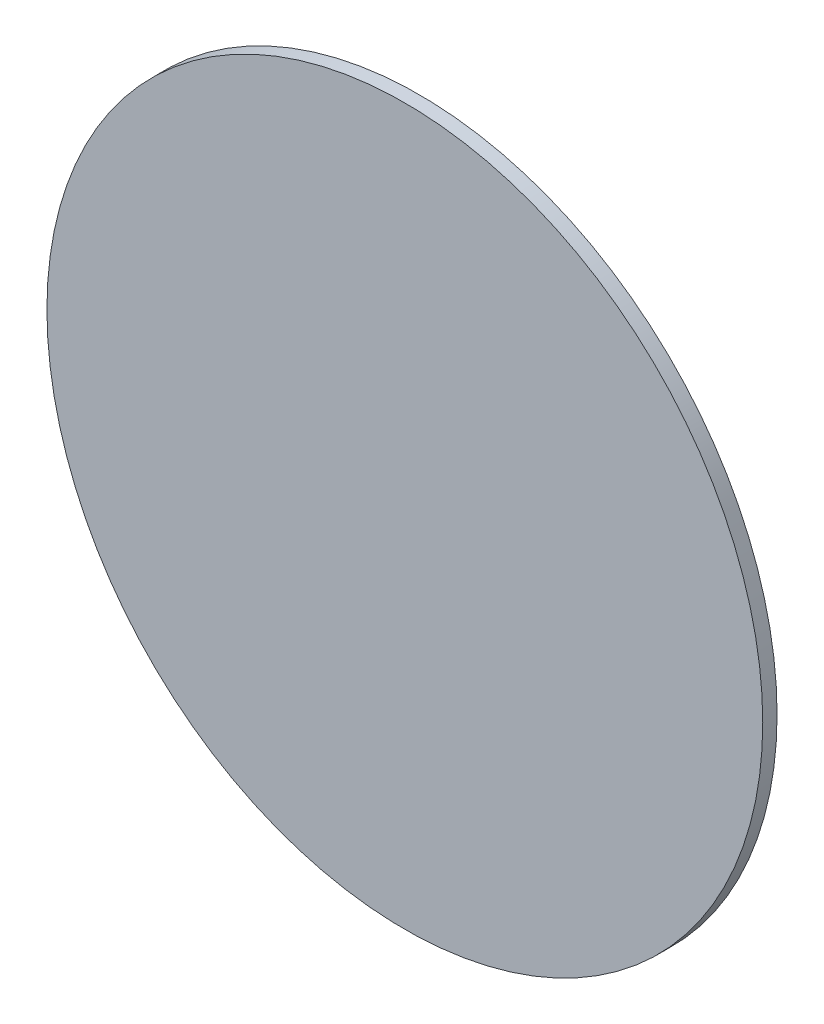
ISO-10303-21;
HEADER;
FILE_DESCRIPTION(('STEP AP214'),'2;1');
FILE_NAME('part.step','',(''),(''),'','','');
FILE_SCHEMA(('AUTOMOTIVE_DESIGN { 1 0 10303 214 1 1 1 1 }'));
ENDSEC;
DATA;
#1=APPLICATION_CONTEXT('core data for automotive mechanical design processes');
#2=APPLICATION_PROTOCOL_DEFINITION('international standard','automotive_design',2000,#1);
#3=PRODUCT_CONTEXT('',#1,'mechanical');
#4=PRODUCT('Part','Part','',(#3));
#5=PRODUCT_RELATED_PRODUCT_CATEGORY('part','',(#4));
#6=PRODUCT_DEFINITION_FORMATION('','',#4);
#7=PRODUCT_DEFINITION_CONTEXT('part definition',#1,'design');
#8=PRODUCT_DEFINITION('design','',#6,#7);
#9=PRODUCT_DEFINITION_SHAPE('','',#8);
#10=(LENGTH_UNIT() NAMED_UNIT(*) SI_UNIT(.MILLI.,.METRE.));
#11=(NAMED_UNIT(*) PLANE_ANGLE_UNIT() SI_UNIT($,.RADIAN.));
#12=(NAMED_UNIT(*) SI_UNIT($,.STERADIAN.) SOLID_ANGLE_UNIT());
#13=UNCERTAINTY_MEASURE_WITH_UNIT(LENGTH_MEASURE(1.E-05),#10,'distance_accuracy_value','');
#14=(GEOMETRIC_REPRESENTATION_CONTEXT(3) GLOBAL_UNCERTAINTY_ASSIGNED_CONTEXT((#13)) GLOBAL_UNIT_ASSIGNED_CONTEXT((#10,
#11,#12)) REPRESENTATION_CONTEXT('',''));
#15=CARTESIAN_POINT('',(0.,0.,0.));
#16=DIRECTION('',(0.,0.,1.));
#17=DIRECTION('',(1.,0.,0.));
#18=AXIS2_PLACEMENT_3D('',#15,#16,#17);
#19=CARTESIAN_POINT('',(0.,0.,5.));
#20=DIRECTION('',(0.,0.,-1.));
#21=DIRECTION('',(-1.,0.,0.));
#22=AXIS2_PLACEMENT_3D('',#19,#20,#21);
#23=CYLINDRICAL_SURFACE('',#22,125.);
#24=CARTESIAN_POINT('',(0.,0.,5.));
#25=DIRECTION('',(0.,0.,1.));
#26=DIRECTION('',(1.,0.,0.));
#27=AXIS2_PLACEMENT_3D('',#24,#25,#26);
#28=CIRCLE('',#27,125.);
#29=CARTESIAN_POINT('',(125.,0.,5.));
#30=VERTEX_POINT('',#29);
#31=EDGE_CURVE('E10',#30,#30,#28,.T.);
#32=ORIENTED_EDGE('',*,*,#31,.F.);
#33=EDGE_LOOP('',(#32));
#34=FACE_BOUND('',#33,.T.);
#35=CARTESIAN_POINT('',(0.,0.,0.));
#36=DIRECTION('',(0.,0.,1.));
#37=DIRECTION('',(1.,0.,0.));
#38=AXIS2_PLACEMENT_3D('',#35,#36,#37);
#39=CIRCLE('',#38,125.);
#40=CARTESIAN_POINT('',(125.,0.,0.));
#41=VERTEX_POINT('',#40);
#42=EDGE_CURVE('E34',#41,#41,#39,.T.);
#43=ORIENTED_EDGE('',*,*,#42,.T.);
#44=EDGE_LOOP('',(#43));
#45=FACE_BOUND('',#44,.T.);
#46=ADVANCED_FACE('F31',(#34,#45),#23,.T.);
#47=CARTESIAN_POINT('',(0.,0.,5.));
#48=DIRECTION('',(0.,0.,1.));
#49=DIRECTION('',(1.,0.,0.));
#50=AXIS2_PLACEMENT_3D('',#47,#48,#49);
#51=PLANE('',#50);
#52=ORIENTED_EDGE('',*,*,#31,.T.);
#53=EDGE_LOOP('',(#52));
#54=FACE_BOUND('',#53,.T.);
#55=ADVANCED_FACE('F46',(#54),#51,.T.);
#56=CARTESIAN_POINT('',(0.,0.,0.));
#57=DIRECTION('',(0.,0.,1.));
#58=DIRECTION('',(1.,0.,0.));
#59=AXIS2_PLACEMENT_3D('',#56,#57,#58);
#60=PLANE('',#59);
#61=ORIENTED_EDGE('',*,*,#42,.F.);
#62=EDGE_LOOP('',(#61));
#63=FACE_BOUND('',#62,.T.);
#64=ADVANCED_FACE('F44',(#63),#60,.F.);
#65=CLOSED_SHELL('',(#46,#55,#64));
#66=MANIFOLD_SOLID_BREP('B2',#65);
#67=ADVANCED_BREP_SHAPE_REPRESENTATION('',(#18,#66),#14);
#68=SHAPE_DEFINITION_REPRESENTATION(#9,#67);
ENDSEC;
END-ISO-10303-21;
